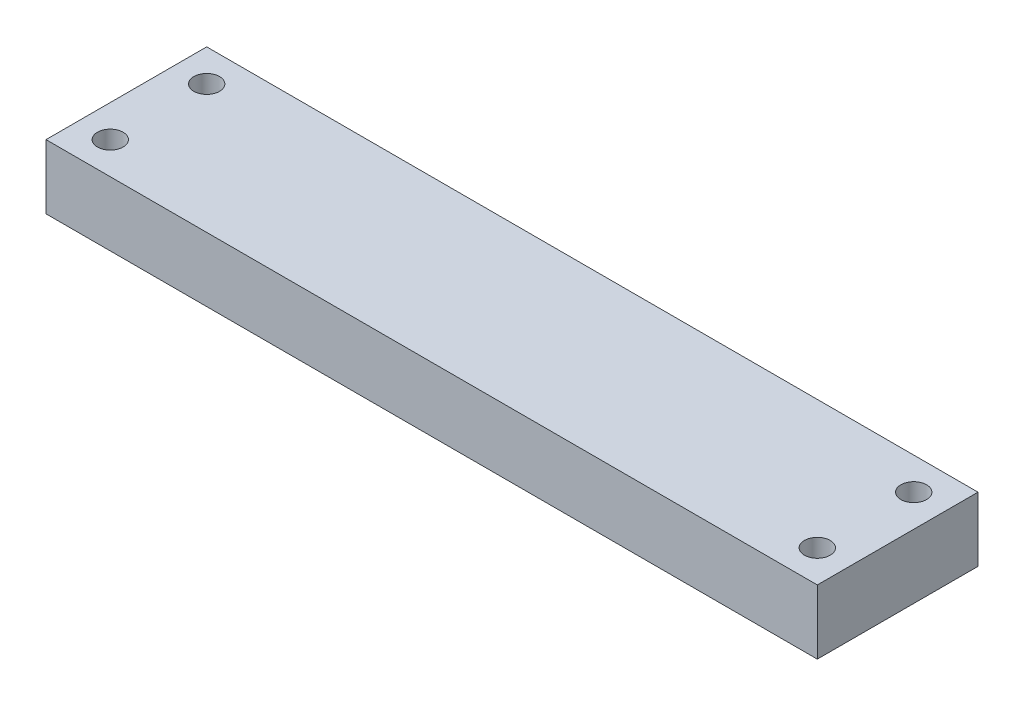
ISO-10303-21;
HEADER;
FILE_DESCRIPTION(('STEP AP214'),'2;1');
FILE_NAME('part.step','',(''),(''),'','','');
FILE_SCHEMA(('AUTOMOTIVE_DESIGN { 1 0 10303 214 1 1 1 1 }'));
ENDSEC;
DATA;
#1=APPLICATION_CONTEXT('core data for automotive mechanical design processes');
#2=APPLICATION_PROTOCOL_DEFINITION('international standard','automotive_design',2000,#1);
#3=PRODUCT_CONTEXT('',#1,'mechanical');
#4=PRODUCT('Part','Part','',(#3));
#5=PRODUCT_RELATED_PRODUCT_CATEGORY('part','',(#4));
#6=PRODUCT_DEFINITION_FORMATION('','',#4);
#7=PRODUCT_DEFINITION_CONTEXT('part definition',#1,'design');
#8=PRODUCT_DEFINITION('design','',#6,#7);
#9=PRODUCT_DEFINITION_SHAPE('','',#8);
#10=(LENGTH_UNIT() NAMED_UNIT(*) SI_UNIT(.MILLI.,.METRE.));
#11=(NAMED_UNIT(*) PLANE_ANGLE_UNIT() SI_UNIT($,.RADIAN.));
#12=(NAMED_UNIT(*) SI_UNIT($,.STERADIAN.) SOLID_ANGLE_UNIT());
#13=UNCERTAINTY_MEASURE_WITH_UNIT(LENGTH_MEASURE(1.E-05),#10,'distance_accuracy_value','');
#14=(GEOMETRIC_REPRESENTATION_CONTEXT(3) GLOBAL_UNCERTAINTY_ASSIGNED_CONTEXT((#13)) GLOBAL_UNIT_ASSIGNED_CONTEXT((#10,
#11,#12)) REPRESENTATION_CONTEXT('',''));
#15=CARTESIAN_POINT('',(0.,0.,0.));
#16=DIRECTION('',(0.,0.,1.));
#17=DIRECTION('',(1.,0.,0.));
#18=AXIS2_PLACEMENT_3D('',#15,#16,#17);
#19=CARTESIAN_POINT('',(0.,20.,0.));
#20=DIRECTION('',(0.,-1.,0.));
#21=DIRECTION('',(0.,0.,-1.));
#22=AXIS2_PLACEMENT_3D('',#19,#20,#21);
#23=PLANE('',#22);
#24=DIRECTION('',(0.,0.,1.));
#25=VECTOR('',#24,1.);
#26=CARTESIAN_POINT('',(0.,20.,0.));
#27=LINE('',#26,#25);
#28=CARTESIAN_POINT('',(0.,20.,-50.));
#29=VERTEX_POINT('',#28);
#30=CARTESIAN_POINT('',(0.,20.,0.));
#31=VERTEX_POINT('',#30);
#32=EDGE_CURVE('E89',#29,#31,#27,.T.);
#33=ORIENTED_EDGE('',*,*,#32,.T.);
#34=DIRECTION('',(1.,0.,0.));
#35=VECTOR('',#34,1.);
#36=CARTESIAN_POINT('',(0.,20.,0.));
#37=LINE('',#36,#35);
#38=CARTESIAN_POINT('',(240.,20.,0.));
#39=VERTEX_POINT('',#38);
#40=EDGE_CURVE('E84',#31,#39,#37,.T.);
#41=ORIENTED_EDGE('',*,*,#40,.T.);
#42=DIRECTION('',(0.,0.,-1.));
#43=VECTOR('',#42,1.);
#44=CARTESIAN_POINT('',(240.,20.,0.));
#45=LINE('',#44,#43);
#46=CARTESIAN_POINT('',(240.,20.,-50.));
#47=VERTEX_POINT('',#46);
#48=EDGE_CURVE('E87',#39,#47,#45,.T.);
#49=ORIENTED_EDGE('',*,*,#48,.T.);
#50=DIRECTION('',(-1.,0.,0.));
#51=VECTOR('',#50,1.);
#52=CARTESIAN_POINT('',(0.,20.,-50.));
#53=LINE('',#52,#51);
#54=EDGE_CURVE('E54',#47,#29,#53,.T.);
#55=ORIENTED_EDGE('',*,*,#54,.T.);
#56=EDGE_LOOP('',(#33,#41,#49,#55));
#57=FACE_BOUND('',#56,.T.);
#58=CARTESIAN_POINT('',(10.,20.,-40.));
#59=DIRECTION('',(0.,1.,0.));
#60=DIRECTION('',(0.,0.,1.));
#61=AXIS2_PLACEMENT_3D('',#58,#59,#60);
#62=CIRCLE('',#61,4.);
#63=CARTESIAN_POINT('',(10.,20.,-36.));
#64=VERTEX_POINT('',#63);
#65=EDGE_CURVE('E104',#64,#64,#62,.T.);
#66=ORIENTED_EDGE('',*,*,#65,.F.);
#67=EDGE_LOOP('',(#66));
#68=FACE_BOUND('',#67,.T.);
#69=CARTESIAN_POINT('',(10.,20.,-10.));
#70=DIRECTION('',(0.,1.,0.));
#71=DIRECTION('',(0.,0.,1.));
#72=AXIS2_PLACEMENT_3D('',#69,#70,#71);
#73=CIRCLE('',#72,4.);
#74=CARTESIAN_POINT('',(10.,20.,-6.));
#75=VERTEX_POINT('',#74);
#76=EDGE_CURVE('E119',#75,#75,#73,.T.);
#77=ORIENTED_EDGE('',*,*,#76,.F.);
#78=EDGE_LOOP('',(#77));
#79=FACE_BOUND('',#78,.T.);
#80=CARTESIAN_POINT('',(230.,20.,-10.));
#81=DIRECTION('',(0.,1.,0.));
#82=DIRECTION('',(0.,0.,1.));
#83=AXIS2_PLACEMENT_3D('',#80,#81,#82);
#84=CIRCLE('',#83,3.99999999999999);
#85=CARTESIAN_POINT('',(230.,20.,-6.00000000000001));
#86=VERTEX_POINT('',#85);
#87=EDGE_CURVE('E125',#86,#86,#84,.T.);
#88=ORIENTED_EDGE('',*,*,#87,.F.);
#89=EDGE_LOOP('',(#88));
#90=FACE_BOUND('',#89,.T.);
#91=CARTESIAN_POINT('',(230.,20.,-40.));
#92=DIRECTION('',(0.,1.,0.));
#93=DIRECTION('',(0.,0.,1.));
#94=AXIS2_PLACEMENT_3D('',#91,#92,#93);
#95=CIRCLE('',#94,3.99999999999999);
#96=CARTESIAN_POINT('',(230.,20.,-36.));
#97=VERTEX_POINT('',#96);
#98=EDGE_CURVE('E131',#97,#97,#95,.T.);
#99=ORIENTED_EDGE('',*,*,#98,.F.);
#100=EDGE_LOOP('',(#99));
#101=FACE_BOUND('',#100,.T.);
#102=ADVANCED_FACE('F37',(#57,#68,#79,#90,#101),#23,.F.);
#103=CARTESIAN_POINT('',(0.,0.,0.));
#104=DIRECTION('',(0.,-1.,0.));
#105=DIRECTION('',(0.,0.,-1.));
#106=AXIS2_PLACEMENT_3D('',#103,#104,#105);
#107=PLANE('',#106);
#108=CARTESIAN_POINT('',(230.,0.,-10.));
#109=DIRECTION('',(0.,1.,0.));
#110=DIRECTION('',(0.,0.,1.));
#111=AXIS2_PLACEMENT_3D('',#108,#109,#110);
#112=CIRCLE('',#111,3.99999999999999);
#113=CARTESIAN_POINT('',(230.,0.,-6.00000000000001));
#114=VERTEX_POINT('',#113);
#115=EDGE_CURVE('E128',#114,#114,#112,.T.);
#116=ORIENTED_EDGE('',*,*,#115,.T.);
#117=EDGE_LOOP('',(#116));
#118=FACE_BOUND('',#117,.T.);
#119=CARTESIAN_POINT('',(10.,0.,-40.));
#120=DIRECTION('',(0.,1.,0.));
#121=DIRECTION('',(0.,0.,1.));
#122=AXIS2_PLACEMENT_3D('',#119,#120,#121);
#123=CIRCLE('',#122,4.);
#124=CARTESIAN_POINT('',(10.,0.,-36.));
#125=VERTEX_POINT('',#124);
#126=EDGE_CURVE('E116',#125,#125,#123,.T.);
#127=ORIENTED_EDGE('',*,*,#126,.T.);
#128=EDGE_LOOP('',(#127));
#129=FACE_BOUND('',#128,.T.);
#130=DIRECTION('',(0.,0.,1.));
#131=VECTOR('',#130,1.);
#132=CARTESIAN_POINT('',(0.,0.,0.));
#133=LINE('',#132,#131);
#134=CARTESIAN_POINT('',(0.,0.,-50.));
#135=VERTEX_POINT('',#134);
#136=CARTESIAN_POINT('',(0.,0.,0.));
#137=VERTEX_POINT('',#136);
#138=EDGE_CURVE('E101',#135,#137,#133,.T.);
#139=ORIENTED_EDGE('',*,*,#138,.F.);
#140=DIRECTION('',(-1.,0.,0.));
#141=VECTOR('',#140,1.);
#142=CARTESIAN_POINT('',(0.,0.,-50.));
#143=LINE('',#142,#141);
#144=CARTESIAN_POINT('',(240.,0.,-50.));
#145=VERTEX_POINT('',#144);
#146=EDGE_CURVE('E77',#145,#135,#143,.T.);
#147=ORIENTED_EDGE('',*,*,#146,.F.);
#148=DIRECTION('',(0.,0.,-1.));
#149=VECTOR('',#148,1.);
#150=CARTESIAN_POINT('',(240.,0.,0.));
#151=LINE('',#150,#149);
#152=CARTESIAN_POINT('',(240.,0.,0.));
#153=VERTEX_POINT('',#152);
#154=EDGE_CURVE('E71',#153,#145,#151,.T.);
#155=ORIENTED_EDGE('',*,*,#154,.F.);
#156=DIRECTION('',(1.,0.,0.));
#157=VECTOR('',#156,1.);
#158=CARTESIAN_POINT('',(0.,0.,0.));
#159=LINE('',#158,#157);
#160=EDGE_CURVE('E93',#137,#153,#159,.T.);
#161=ORIENTED_EDGE('',*,*,#160,.F.);
#162=EDGE_LOOP('',(#139,#147,#155,#161));
#163=FACE_BOUND('',#162,.T.);
#164=CARTESIAN_POINT('',(10.,0.,-10.));
#165=DIRECTION('',(0.,1.,0.));
#166=DIRECTION('',(0.,0.,1.));
#167=AXIS2_PLACEMENT_3D('',#164,#165,#166);
#168=CIRCLE('',#167,4.);
#169=CARTESIAN_POINT('',(10.,0.,-6.));
#170=VERTEX_POINT('',#169);
#171=EDGE_CURVE('E122',#170,#170,#168,.T.);
#172=ORIENTED_EDGE('',*,*,#171,.T.);
#173=EDGE_LOOP('',(#172));
#174=FACE_BOUND('',#173,.T.);
#175=CARTESIAN_POINT('',(230.,0.,-40.));
#176=DIRECTION('',(0.,1.,0.));
#177=DIRECTION('',(0.,0.,1.));
#178=AXIS2_PLACEMENT_3D('',#175,#176,#177);
#179=CIRCLE('',#178,3.99999999999999);
#180=CARTESIAN_POINT('',(230.,0.,-36.));
#181=VERTEX_POINT('',#180);
#182=EDGE_CURVE('E134',#181,#181,#179,.T.);
#183=ORIENTED_EDGE('',*,*,#182,.T.);
#184=EDGE_LOOP('',(#183));
#185=FACE_BOUND('',#184,.T.);
#186=ADVANCED_FACE('F112',(#118,#129,#163,#174,#185),#107,.T.);
#187=CARTESIAN_POINT('',(0.,20.,0.));
#188=DIRECTION('',(1.,0.,0.));
#189=DIRECTION('',(0.,0.,-1.));
#190=AXIS2_PLACEMENT_3D('',#187,#188,#189);
#191=PLANE('',#190);
#192=ORIENTED_EDGE('',*,*,#138,.T.);
#193=DIRECTION('',(0.,-1.,0.));
#194=VECTOR('',#193,1.);
#195=CARTESIAN_POINT('',(0.,20.,0.));
#196=LINE('',#195,#194);
#197=EDGE_CURVE('E11',#31,#137,#196,.T.);
#198=ORIENTED_EDGE('',*,*,#197,.F.);
#199=ORIENTED_EDGE('',*,*,#32,.F.);
#200=DIRECTION('',(0.,-1.,0.));
#201=VECTOR('',#200,1.);
#202=CARTESIAN_POINT('',(0.,20.,-50.));
#203=LINE('',#202,#201);
#204=EDGE_CURVE('E97',#29,#135,#203,.T.);
#205=ORIENTED_EDGE('',*,*,#204,.T.);
#206=EDGE_LOOP('',(#192,#198,#199,#205));
#207=FACE_BOUND('',#206,.T.);
#208=ADVANCED_FACE('F39',(#207),#191,.F.);
#209=CARTESIAN_POINT('',(0.,20.,0.));
#210=DIRECTION('',(0.,0.,-1.));
#211=DIRECTION('',(-1.,0.,0.));
#212=AXIS2_PLACEMENT_3D('',#209,#210,#211);
#213=PLANE('',#212);
#214=ORIENTED_EDGE('',*,*,#160,.T.);
#215=DIRECTION('',(0.,-1.,0.));
#216=VECTOR('',#215,1.);
#217=CARTESIAN_POINT('',(240.,20.,0.));
#218=LINE('',#217,#216);
#219=EDGE_CURVE('E46',#39,#153,#218,.T.);
#220=ORIENTED_EDGE('',*,*,#219,.F.);
#221=ORIENTED_EDGE('',*,*,#40,.F.);
#222=ORIENTED_EDGE('',*,*,#197,.T.);
#223=EDGE_LOOP('',(#214,#220,#221,#222));
#224=FACE_BOUND('',#223,.T.);
#225=ADVANCED_FACE('F92',(#224),#213,.F.);
#226=CARTESIAN_POINT('',(240.,20.,0.));
#227=DIRECTION('',(-1.,0.,0.));
#228=DIRECTION('',(0.,0.,1.));
#229=AXIS2_PLACEMENT_3D('',#226,#227,#228);
#230=PLANE('',#229);
#231=ORIENTED_EDGE('',*,*,#154,.T.);
#232=DIRECTION('',(0.,-1.,0.));
#233=VECTOR('',#232,1.);
#234=CARTESIAN_POINT('',(240.,20.,-50.));
#235=LINE('',#234,#233);
#236=EDGE_CURVE('E94',#47,#145,#235,.T.);
#237=ORIENTED_EDGE('',*,*,#236,.F.);
#238=ORIENTED_EDGE('',*,*,#48,.F.);
#239=ORIENTED_EDGE('',*,*,#219,.T.);
#240=EDGE_LOOP('',(#231,#237,#238,#239));
#241=FACE_BOUND('',#240,.T.);
#242=ADVANCED_FACE('F95',(#241),#230,.F.);
#243=CARTESIAN_POINT('',(0.,20.,-50.));
#244=DIRECTION('',(0.,0.,1.));
#245=DIRECTION('',(1.,0.,0.));
#246=AXIS2_PLACEMENT_3D('',#243,#244,#245);
#247=PLANE('',#246);
#248=ORIENTED_EDGE('',*,*,#146,.T.);
#249=ORIENTED_EDGE('',*,*,#204,.F.);
#250=ORIENTED_EDGE('',*,*,#54,.F.);
#251=ORIENTED_EDGE('',*,*,#236,.T.);
#252=EDGE_LOOP('',(#248,#249,#250,#251));
#253=FACE_BOUND('',#252,.T.);
#254=ADVANCED_FACE('F109',(#253),#247,.F.);
#255=CARTESIAN_POINT('',(10.,20.,-40.));
#256=DIRECTION('',(0.,-1.,0.));
#257=DIRECTION('',(0.,0.,-1.));
#258=AXIS2_PLACEMENT_3D('',#255,#256,#257);
#259=CYLINDRICAL_SURFACE('',#258,4.);
#260=ORIENTED_EDGE('',*,*,#65,.T.);
#261=EDGE_LOOP('',(#260));
#262=FACE_BOUND('',#261,.T.);
#263=ORIENTED_EDGE('',*,*,#126,.F.);
#264=EDGE_LOOP('',(#263));
#265=FACE_BOUND('',#264,.T.);
#266=ADVANCED_FACE('F151',(#262,#265),#259,.F.);
#267=CARTESIAN_POINT('',(10.,20.,-10.));
#268=DIRECTION('',(0.,-1.,0.));
#269=DIRECTION('',(0.,0.,-1.));
#270=AXIS2_PLACEMENT_3D('',#267,#268,#269);
#271=CYLINDRICAL_SURFACE('',#270,4.);
#272=ORIENTED_EDGE('',*,*,#76,.T.);
#273=EDGE_LOOP('',(#272));
#274=FACE_BOUND('',#273,.T.);
#275=ORIENTED_EDGE('',*,*,#171,.F.);
#276=EDGE_LOOP('',(#275));
#277=FACE_BOUND('',#276,.T.);
#278=ADVANCED_FACE('F197',(#274,#277),#271,.F.);
#279=CARTESIAN_POINT('',(230.,20.,-10.));
#280=DIRECTION('',(0.,-1.,0.));
#281=DIRECTION('',(0.,0.,-1.));
#282=AXIS2_PLACEMENT_3D('',#279,#280,#281);
#283=CYLINDRICAL_SURFACE('',#282,3.99999999999999);
#284=ORIENTED_EDGE('',*,*,#87,.T.);
#285=EDGE_LOOP('',(#284));
#286=FACE_BOUND('',#285,.T.);
#287=ORIENTED_EDGE('',*,*,#115,.F.);
#288=EDGE_LOOP('',(#287));
#289=FACE_BOUND('',#288,.T.);
#290=ADVANCED_FACE('F205',(#286,#289),#283,.F.);
#291=CARTESIAN_POINT('',(230.,20.,-40.));
#292=DIRECTION('',(0.,-1.,0.));
#293=DIRECTION('',(0.,0.,-1.));
#294=AXIS2_PLACEMENT_3D('',#291,#292,#293);
#295=CYLINDRICAL_SURFACE('',#294,3.99999999999999);
#296=ORIENTED_EDGE('',*,*,#98,.T.);
#297=EDGE_LOOP('',(#296));
#298=FACE_BOUND('',#297,.T.);
#299=ORIENTED_EDGE('',*,*,#182,.F.);
#300=EDGE_LOOP('',(#299));
#301=FACE_BOUND('',#300,.T.);
#302=ADVANCED_FACE('F140',(#298,#301),#295,.F.);
#303=CLOSED_SHELL('',(#102,#186,#208,#225,#242,#254,#266,#278,#290,#302));
#304=MANIFOLD_SOLID_BREP('B2',#303);
#305=ADVANCED_BREP_SHAPE_REPRESENTATION('',(#18,#304),#14);
#306=SHAPE_DEFINITION_REPRESENTATION(#9,#305);
ENDSEC;
END-ISO-10303-21;
